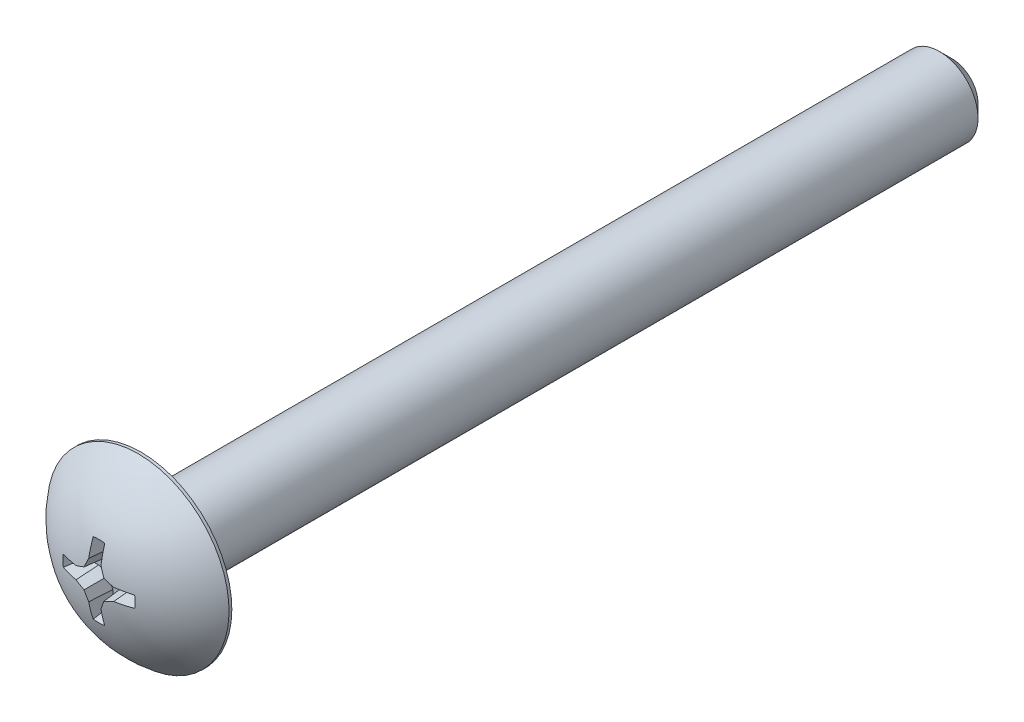
ISO-10303-21;
HEADER;
FILE_DESCRIPTION(('STEP AP214'),'2;1');
FILE_NAME('part.step','',(''),(''),'','','');
FILE_SCHEMA(('AUTOMOTIVE_DESIGN { 1 0 10303 214 1 1 1 1 }'));
ENDSEC;
DATA;
#1=APPLICATION_CONTEXT('core data for automotive mechanical design processes');
#2=APPLICATION_PROTOCOL_DEFINITION('international standard','automotive_design',2000,#1);
#3=PRODUCT_CONTEXT('',#1,'mechanical');
#4=PRODUCT('Part','Part','',(#3));
#5=PRODUCT_RELATED_PRODUCT_CATEGORY('part','',(#4));
#6=PRODUCT_DEFINITION_FORMATION('','',#4);
#7=PRODUCT_DEFINITION_CONTEXT('part definition',#1,'design');
#8=PRODUCT_DEFINITION('design','',#6,#7);
#9=PRODUCT_DEFINITION_SHAPE('','',#8);
#10=(LENGTH_UNIT() NAMED_UNIT(*) SI_UNIT(.MILLI.,.METRE.));
#11=(NAMED_UNIT(*) PLANE_ANGLE_UNIT() SI_UNIT($,.RADIAN.));
#12=(NAMED_UNIT(*) SI_UNIT($,.STERADIAN.) SOLID_ANGLE_UNIT());
#13=UNCERTAINTY_MEASURE_WITH_UNIT(LENGTH_MEASURE(1.E-05),#10,'distance_accuracy_value','');
#14=(GEOMETRIC_REPRESENTATION_CONTEXT(3) GLOBAL_UNCERTAINTY_ASSIGNED_CONTEXT((#13)) GLOBAL_UNIT_ASSIGNED_CONTEXT((#10,
#11,#12)) REPRESENTATION_CONTEXT('',''));
#15=CARTESIAN_POINT('',(0.,0.,0.));
#16=DIRECTION('',(0.,0.,1.));
#17=DIRECTION('',(1.,0.,0.));
#18=AXIS2_PLACEMENT_3D('',#15,#16,#17);
#19=CARTESIAN_POINT('',(0.,2.41299999999999,0.));
#20=DIRECTION('',(0.,0.,-1.));
#21=DIRECTION('',(0.,1.,0.));
#22=AXIS2_PLACEMENT_3D('',#19,#20,#21);
#23=PLANE('',#22);
#24=CARTESIAN_POINT('',(0.,0.,0.));
#25=DIRECTION('',(0.,0.,1.));
#26=DIRECTION('',(0.,-1.,0.));
#27=AXIS2_PLACEMENT_3D('',#24,#25,#26);
#28=CIRCLE('',#27,2.41299999999999);
#29=CARTESIAN_POINT('',(0.,-2.41299999999999,0.));
#30=VERTEX_POINT('',#29);
#31=EDGE_CURVE('E62',#30,#30,#28,.T.);
#32=ORIENTED_EDGE('',*,*,#31,.T.);
#33=EDGE_LOOP('',(#32));
#34=FACE_BOUND('',#33,.T.);
#35=ADVANCED_FACE('F49',(#34),#23,.F.);
#36=CARTESIAN_POINT('',(0.,0.,-50.8));
#37=DIRECTION('',(0.,0.,1.));
#38=DIRECTION('',(0.,-1.,0.));
#39=AXIS2_PLACEMENT_3D('',#36,#37,#38);
#40=PLANE('',#39);
#41=CARTESIAN_POINT('',(0.,0.,-50.8));
#42=DIRECTION('',(0.,0.,1.));
#43=DIRECTION('',(0.,-1.,0.));
#44=AXIS2_PLACEMENT_3D('',#41,#42,#43);
#45=CIRCLE('',#44,1.61925);
#46=CARTESIAN_POINT('',(0.,-1.61925,-50.8));
#47=VERTEX_POINT('',#46);
#48=EDGE_CURVE('E11',#47,#47,#45,.F.);
#49=ORIENTED_EDGE('',*,*,#48,.T.);
#50=EDGE_LOOP('',(#49));
#51=FACE_BOUND('',#50,.T.);
#52=ADVANCED_FACE('F73',(#51),#40,.F.);
#53=CARTESIAN_POINT('',(0.,0.,0.));
#54=DIRECTION('',(0.,0.,1.));
#55=DIRECTION('',(0.,-1.,0.));
#56=AXIS2_PLACEMENT_3D('',#53,#54,#55);
#57=CYLINDRICAL_SURFACE('',#56,2.41299999999999);
#58=CARTESIAN_POINT('',(0.,0.,-50.00625));
#59=DIRECTION('',(0.,0.,1.));
#60=DIRECTION('',(0.,-1.,0.));
#61=AXIS2_PLACEMENT_3D('',#58,#59,#60);
#62=CIRCLE('',#61,2.41299999999999);
#63=CARTESIAN_POINT('',(0.,-2.41299999999999,-50.00625));
#64=VERTEX_POINT('',#63);
#65=EDGE_CURVE('E57',#64,#64,#62,.T.);
#66=ORIENTED_EDGE('',*,*,#65,.T.);
#67=EDGE_LOOP('',(#66));
#68=FACE_BOUND('',#67,.T.);
#69=ORIENTED_EDGE('',*,*,#31,.F.);
#70=EDGE_LOOP('',(#69));
#71=FACE_BOUND('',#70,.T.);
#72=ADVANCED_FACE('F71',(#68,#71),#57,.T.);
#73=CARTESIAN_POINT('',(0.,0.,-50.00625));
#74=DIRECTION('',(0.,0.,1.));
#75=DIRECTION('',(0.,-1.,0.));
#76=AXIS2_PLACEMENT_3D('',#73,#74,#75);
#77=CONICAL_SURFACE('',#76,2.41299999999999,0.785398163397447);
#78=ORIENTED_EDGE('',*,*,#48,.F.);
#79=EDGE_LOOP('',(#78));
#80=FACE_BOUND('',#79,.T.);
#81=ORIENTED_EDGE('',*,*,#65,.F.);
#82=EDGE_LOOP('',(#81));
#83=FACE_BOUND('',#82,.T.);
#84=ADVANCED_FACE('F51',(#80,#83),#77,.T.);
#85=CLOSED_SHELL('',(#35,#52,#72,#84));
#86=MANIFOLD_SOLID_BREP('B2',#85);
#87=CARTESIAN_POINT('',(0.,0.,2.9972));
#88=DIRECTION('',(0.,0.,-1.));
#89=DIRECTION('',(-1.,0.,0.));
#90=AXIS2_PLACEMENT_3D('',#87,#88,#89);
#91=CYLINDRICAL_SURFACE('',#90,5.6896);
#92=CARTESIAN_POINT('',(0.,0.,0.175259999999999));
#93=DIRECTION('',(0.,0.,-1.));
#94=DIRECTION('',(0.,1.,0.));
#95=AXIS2_PLACEMENT_3D('',#92,#93,#94);
#96=CIRCLE('',#95,5.6896);
#97=CARTESIAN_POINT('',(0.,5.6896,0.17526));
#98=VERTEX_POINT('',#97);
#99=EDGE_CURVE('E361',#98,#98,#96,.T.);
#100=ORIENTED_EDGE('',*,*,#99,.T.);
#101=EDGE_LOOP('',(#100));
#102=FACE_BOUND('',#101,.T.);
#103=CARTESIAN_POINT('',(0.,0.,0.));
#104=DIRECTION('',(0.,0.,1.));
#105=DIRECTION('',(1.,0.,0.));
#106=AXIS2_PLACEMENT_3D('',#103,#104,#105);
#107=CIRCLE('',#106,5.6896);
#108=CARTESIAN_POINT('',(5.6896,0.,0.));
#109=VERTEX_POINT('',#108);
#110=EDGE_CURVE('E396',#109,#109,#107,.T.);
#111=ORIENTED_EDGE('',*,*,#110,.T.);
#112=EDGE_LOOP('',(#111));
#113=FACE_BOUND('',#112,.T.);
#114=ADVANCED_FACE('F108',(#102,#113),#91,.T.);
#115=CARTESIAN_POINT('',(0.,0.,0.));
#116=DIRECTION('',(0.,0.,1.));
#117=DIRECTION('',(1.,0.,0.));
#118=AXIS2_PLACEMENT_3D('',#115,#116,#117);
#119=PLANE('',#118);
#120=ORIENTED_EDGE('',*,*,#110,.F.);
#121=EDGE_LOOP('',(#120));
#122=FACE_BOUND('',#121,.T.);
#123=ADVANCED_FACE('F335',(#122),#119,.F.);
#124=CARTESIAN_POINT('',(0.,0.,-4.14946036903689));
#125=DIRECTION('',(0.,0.,-1.));
#126=DIRECTION('',(0.,1.,0.));
#127=AXIS2_PLACEMENT_3D('',#124,#125,#126);
#128=SPHERICAL_SURFACE('',#127,7.1466603690369);
#129=CARTESIAN_POINT('',(0.,0.,2.62924448609153));
#130=DIRECTION('',(0.,0.,-1.));
#131=DIRECTION('',(-1.,0.,0.));
#132=AXIS2_PLACEMENT_3D('',#129,#130,#131);
#133=CIRCLE('',#132,2.26360661719765);
#134=CARTESIAN_POINT('',(2.23455293899956,0.36150806385115,2.62924448609153));
#135=VERTEX_POINT('',#134);
#136=CARTESIAN_POINT('',(2.23455293899956,-0.361508063851161,2.62924448609153));
#137=VERTEX_POINT('',#136);
#138=EDGE_CURVE('E394',#135,#137,#133,.T.);
#139=ORIENTED_EDGE('',*,*,#138,.T.);
#140=CARTESIAN_POINT('',(0.,0.229792868563413,-4.12935609807849));
#141=DIRECTION('',(0.,0.996194698091746,0.0871557427476585));
#142=DIRECTION('',(0.,-0.0871557427476585,0.996194698091746));
#143=AXIS2_PLACEMENT_3D('',#140,#141,#142);
#144=CIRCLE('',#143,7.14293675501955);
#145=CARTESIAN_POINT('',(1.17921292104676,-0.384213013453613,2.88876324757916));
#146=VERTEX_POINT('',#145);
#147=EDGE_CURVE('E47',#137,#146,#144,.F.);
#148=ORIENTED_EDGE('',*,*,#147,.T.);
#149=CARTESIAN_POINT('',(0.0723348983977782,-0.174631892744802,-4.16599749359437));
#150=DIRECTION('',(-0.381227206369642,0.920363891963229,0.0871557427476585));
#151=DIRECTION('',(-0.923879532511292,-0.382683432365078,0.));
#152=AXIS2_PLACEMENT_3D('',#149,#150,#151);
#153=CIRCLE('',#152,7.14414111831395);
#154=CARTESIAN_POINT('',(0.620700606243538,-0.620700606243543,2.94308613734432));
#155=VERTEX_POINT('',#154);
#156=EDGE_CURVE('E124',#146,#155,#153,.F.);
#157=ORIENTED_EDGE('',*,*,#156,.T.);
#158=CARTESIAN_POINT('',(0.174631892744801,-0.0723348983977793,-4.16599749359437));
#159=DIRECTION('',(-0.920363891963226,0.381227206369651,0.0871557427476585));
#160=DIRECTION('',(-0.382683432365087,-0.923879532511288,0.));
#161=AXIS2_PLACEMENT_3D('',#158,#159,#160);
#162=CIRCLE('',#161,7.14414111831395);
#163=CARTESIAN_POINT('',(0.384213013453602,-1.17921292104676,2.88876324757916));
#164=VERTEX_POINT('',#163);
#165=EDGE_CURVE('E428',#155,#164,#162,.F.);
#166=ORIENTED_EDGE('',*,*,#165,.T.);
#167=CARTESIAN_POINT('',(-0.229792868563416,0.,-4.12935609807849));
#168=DIRECTION('',(-0.996194698091746,0.,0.0871557427476585));
#169=DIRECTION('',(0.0871557427476585,0.,0.996194698091746));
#170=AXIS2_PLACEMENT_3D('',#167,#168,#169);
#171=CIRCLE('',#170,7.14293675501955);
#172=CARTESIAN_POINT('',(0.361508063851143,-2.23455293899956,2.62924448609153));
#173=VERTEX_POINT('',#172);
#174=EDGE_CURVE('E431',#164,#173,#171,.F.);
#175=ORIENTED_EDGE('',*,*,#174,.T.);
#176=CARTESIAN_POINT('',(0.,0.,2.62924448609153));
#177=DIRECTION('',(0.,0.,-1.));
#178=DIRECTION('',(0.,1.,0.));
#179=AXIS2_PLACEMENT_3D('',#176,#177,#178);
#180=CIRCLE('',#179,2.26360661719764);
#181=CARTESIAN_POINT('',(-0.361508063851168,-2.23455293899955,2.62924448609153));
#182=VERTEX_POINT('',#181);
#183=EDGE_CURVE('E434',#173,#182,#180,.T.);
#184=ORIENTED_EDGE('',*,*,#183,.T.);
#185=CARTESIAN_POINT('',(0.229792868563412,0.,-4.12935609807849));
#186=DIRECTION('',(0.996194698091746,0.,0.0871557427476584));
#187=DIRECTION('',(0.0871557427476584,0.,-0.996194698091746));
#188=AXIS2_PLACEMENT_3D('',#185,#186,#187);
#189=CIRCLE('',#188,7.14293675501955);
#190=CARTESIAN_POINT('',(-0.384213013453617,-1.17921292104676,2.88876324757916));
#191=VERTEX_POINT('',#190);
#192=EDGE_CURVE('E513',#182,#191,#189,.F.);
#193=ORIENTED_EDGE('',*,*,#192,.T.);
#194=CARTESIAN_POINT('',(-0.174631892744802,-0.072334898397777,-4.16599749359437));
#195=DIRECTION('',(0.920363891963231,0.381227206369639,0.0871557427476585));
#196=DIRECTION('',(-0.382683432365075,0.923879532511293,0.));
#197=AXIS2_PLACEMENT_3D('',#194,#195,#196);
#198=CIRCLE('',#197,7.14414111831395);
#199=CARTESIAN_POINT('',(-0.620700606243545,-0.620700606243536,2.94308613734432));
#200=VERTEX_POINT('',#199);
#201=EDGE_CURVE('E511',#191,#200,#198,.F.);
#202=ORIENTED_EDGE('',*,*,#201,.T.);
#203=CARTESIAN_POINT('',(-0.0723348983977803,-0.1746318927448,-4.16599749359437));
#204=DIRECTION('',(0.381227206369654,0.920363891963224,0.0871557427476586));
#205=DIRECTION('',(-0.923879532511287,0.38268343236509,0.));
#206=AXIS2_PLACEMENT_3D('',#203,#204,#205);
#207=CIRCLE('',#206,7.14414111831395);
#208=CARTESIAN_POINT('',(-1.17921292104676,-0.384213013453598,2.88876324757916));
#209=VERTEX_POINT('',#208);
#210=EDGE_CURVE('E510',#200,#209,#207,.F.);
#211=ORIENTED_EDGE('',*,*,#210,.T.);
#212=CARTESIAN_POINT('',(0.,0.229792868563416,-4.12935609807849));
#213=DIRECTION('',(0.,0.996194698091746,0.0871557427476586));
#214=DIRECTION('',(0.,-0.0871557427476586,0.996194698091746));
#215=AXIS2_PLACEMENT_3D('',#212,#213,#214);
#216=CIRCLE('',#215,7.14293675501955);
#217=CARTESIAN_POINT('',(-2.23455293899956,-0.361508063851135,2.62924448609153));
#218=VERTEX_POINT('',#217);
#219=EDGE_CURVE('E313',#209,#218,#216,.F.);
#220=ORIENTED_EDGE('',*,*,#219,.T.);
#221=CARTESIAN_POINT('',(0.,0.,2.62924448609153));
#222=DIRECTION('',(0.,0.,-1.));
#223=DIRECTION('',(-1.,0.,0.));
#224=AXIS2_PLACEMENT_3D('',#221,#222,#223);
#225=CIRCLE('',#224,2.26360661719764);
#226=CARTESIAN_POINT('',(-2.23455293899955,0.361508063851176,2.62924448609153));
#227=VERTEX_POINT('',#226);
#228=EDGE_CURVE('E271',#218,#227,#225,.T.);
#229=ORIENTED_EDGE('',*,*,#228,.T.);
#230=CARTESIAN_POINT('',(0.,-0.229792868563412,-4.12935609807849));
#231=DIRECTION('',(0.,-0.996194698091746,0.0871557427476582));
#232=DIRECTION('',(0.,-0.0871557427476582,-0.996194698091746));
#233=AXIS2_PLACEMENT_3D('',#230,#231,#232);
#234=CIRCLE('',#233,7.14293675501955);
#235=CARTESIAN_POINT('',(-1.17921292104675,0.38421301345362,2.88876324757916));
#236=VERTEX_POINT('',#235);
#237=EDGE_CURVE('E268',#227,#236,#234,.F.);
#238=ORIENTED_EDGE('',*,*,#237,.T.);
#239=CARTESIAN_POINT('',(-0.0723348983977769,0.174631892744803,-4.16599749359437));
#240=DIRECTION('',(0.381227206369636,-0.920363891963232,0.0871557427476583));
#241=DIRECTION('',(0.923879532511294,0.382683432365072,0.));
#242=AXIS2_PLACEMENT_3D('',#239,#240,#241);
#243=CIRCLE('',#242,7.14414111831395);
#244=CARTESIAN_POINT('',(-0.620700606243533,0.620700606243547,2.94308613734433));
#245=VERTEX_POINT('',#244);
#246=EDGE_CURVE('E264',#236,#245,#243,.F.);
#247=ORIENTED_EDGE('',*,*,#246,.T.);
#248=CARTESIAN_POINT('',(-0.1746318927448,0.0723348983977814,-4.16599749359437));
#249=DIRECTION('',(0.920363891963223,-0.381227206369657,0.0871557427476584));
#250=DIRECTION('',(0.382683432365094,0.923879532511285,0.));
#251=AXIS2_PLACEMENT_3D('',#248,#249,#250);
#252=CIRCLE('',#251,7.14414111831395);
#253=CARTESIAN_POINT('',(-0.384213013453594,1.17921292104676,2.88876324757916));
#254=VERTEX_POINT('',#253);
#255=EDGE_CURVE('E263',#245,#254,#252,.F.);
#256=ORIENTED_EDGE('',*,*,#255,.T.);
#257=CARTESIAN_POINT('',(0.229792868563416,0.,-4.12935609807849));
#258=DIRECTION('',(0.996194698091746,0.,0.0871557427476585));
#259=DIRECTION('',(0.0871557427476585,0.,-0.996194698091746));
#260=AXIS2_PLACEMENT_3D('',#257,#258,#259);
#261=CIRCLE('',#260,7.14293675501955);
#262=CARTESIAN_POINT('',(-0.361508063851127,2.23455293899956,2.62924448609153));
#263=VERTEX_POINT('',#262);
#264=EDGE_CURVE('E250',#254,#263,#261,.F.);
#265=ORIENTED_EDGE('',*,*,#264,.T.);
#266=CARTESIAN_POINT('',(0.,0.,2.62924448609153));
#267=DIRECTION('',(0.,0.,-1.));
#268=DIRECTION('',(-1.,0.,0.));
#269=AXIS2_PLACEMENT_3D('',#266,#267,#268);
#270=CIRCLE('',#269,2.26360661719765);
#271=CARTESIAN_POINT('',(0.361508063851153,2.23455293899956,2.62924448609153));
#272=VERTEX_POINT('',#271);
#273=EDGE_CURVE('E242',#263,#272,#270,.T.);
#274=ORIENTED_EDGE('',*,*,#273,.T.);
#275=CARTESIAN_POINT('',(-0.229792868563412,0.,-4.12935609807849));
#276=DIRECTION('',(-0.996194698091746,0.,0.0871557427476584));
#277=DIRECTION('',(0.0871557427476584,0.,0.996194698091746));
#278=AXIS2_PLACEMENT_3D('',#275,#276,#277);
#279=CIRCLE('',#278,7.14293675501955);
#280=CARTESIAN_POINT('',(0.384213013453608,1.17921292104676,2.88876324757915));
#281=VERTEX_POINT('',#280);
#282=EDGE_CURVE('E133',#272,#281,#279,.F.);
#283=ORIENTED_EDGE('',*,*,#282,.T.);
#284=CARTESIAN_POINT('',(0.174631892744802,0.0723348983977793,-4.16599749359437));
#285=DIRECTION('',(-0.920363891963228,-0.381227206369645,0.0871557427476584));
#286=DIRECTION('',(0.382683432365081,-0.92387953251129,0.));
#287=AXIS2_PLACEMENT_3D('',#284,#285,#286);
#288=CIRCLE('',#287,7.14414111831395);
#289=CARTESIAN_POINT('',(0.620700606243541,0.62070060624354,2.94308613734433));
#290=VERTEX_POINT('',#289);
#291=EDGE_CURVE('E684',#281,#290,#288,.F.);
#292=ORIENTED_EDGE('',*,*,#291,.T.);
#293=CARTESIAN_POINT('',(0.0723348983977791,0.174631892744802,-4.16599749359437));
#294=DIRECTION('',(-0.381227206369648,-0.920363891963227,0.0871557427476584));
#295=DIRECTION('',(0.923879532511289,-0.382683432365084,0.));
#296=AXIS2_PLACEMENT_3D('',#293,#294,#295);
#297=CIRCLE('',#296,7.14414111831395);
#298=CARTESIAN_POINT('',(1.17921292104676,0.384213013453606,2.88876324757916));
#299=VERTEX_POINT('',#298);
#300=EDGE_CURVE('E695',#290,#299,#297,.F.);
#301=ORIENTED_EDGE('',*,*,#300,.T.);
#302=CARTESIAN_POINT('',(0.,-0.229792868563415,-4.12935609807849));
#303=DIRECTION('',(0.,-0.996194698091746,0.0871557427476584));
#304=DIRECTION('',(0.,-0.0871557427476584,-0.996194698091746));
#305=AXIS2_PLACEMENT_3D('',#302,#303,#304);
#306=CIRCLE('',#305,7.14293675501955);
#307=EDGE_CURVE('E387',#299,#135,#306,.F.);
#308=ORIENTED_EDGE('',*,*,#307,.T.);
#309=EDGE_LOOP('',(#139,#148,#157,#166,#175,#184,#193,#202,#211,#220,#229,#238,#247,#256,#265,
#274,#283,#292,#301,#308));
#310=FACE_BOUND('',#309,.T.);
#311=ORIENTED_EDGE('',*,*,#99,.F.);
#312=EDGE_LOOP('',(#311));
#313=FACE_BOUND('',#312,.T.);
#314=ADVANCED_FACE('F260',(#310,#313),#128,.T.);
#315=CARTESIAN_POINT('',(0.,0.,2.99720000000001));
#316=DIRECTION('',(0.,0.,1.));
#317=DIRECTION('',(1.,0.,0.));
#318=AXIS2_PLACEMENT_3D('',#315,#316,#317);
#319=CONICAL_SURFACE('',#318,2.3622,0.26179938779915);
#320=ORIENTED_EDGE('',*,*,#273,.F.);
#321=CARTESIAN_POINT('',(-0.262589488840027,1.94298750337409,1.4986));
#322=CARTESIAN_POINT('',(-0.279073393107845,1.99169451778232,1.68701188793488));
#323=CARTESIAN_POINT('',(-0.295558559878558,2.04034514477638,1.87543820634387));
#324=CARTESIAN_POINT('',(-0.328531418215623,2.13753362331677,2.25231970170808));
#325=CARTESIAN_POINT('',(-0.345019109781944,2.18607147486453,2.44077487866293));
#326=CARTESIAN_POINT('',(-0.361508063851127,2.23455293899956,2.62924448609153));
#327=B_SPLINE_CURVE_WITH_KNOTS('',3,(#321,#322,#323,#324,#325,#326),.UNSPECIFIED.,.F.,.F.,(4,2,
4),(0.,0.585907923906023,1.17181584034365),.UNSPECIFIED.);
#328=CARTESIAN_POINT('',(-0.262589488840027,1.94298750337409,1.4986));
#329=VERTEX_POINT('',#328);
#330=EDGE_CURVE('E112',#329,#263,#327,.T.);
#331=ORIENTED_EDGE('',*,*,#330,.F.);
#332=CARTESIAN_POINT('',(0.,0.,1.4986));
#333=DIRECTION('',(0.,0.,1.));
#334=DIRECTION('',(1.,0.,0.));
#335=AXIS2_PLACEMENT_3D('',#332,#333,#334);
#336=CIRCLE('',#335,1.96065134022272);
#337=CARTESIAN_POINT('',(0.26258948884005,1.94298750337409,1.4986));
#338=VERTEX_POINT('',#337);
#339=EDGE_CURVE('E386',#338,#329,#336,.T.);
#340=ORIENTED_EDGE('',*,*,#339,.F.);
#341=CARTESIAN_POINT('',(0.26258948884005,1.94298750337409,1.4986));
#342=CARTESIAN_POINT('',(0.284499109870333,2.00773502668209,1.74902811430982));
#343=CARTESIAN_POINT('',(0.30641133893513,2.07236620771867,1.99948603859054));
#344=CARTESIAN_POINT('',(0.350239968451299,2.20144176390614,2.5004495663187));
#345=CARTESIAN_POINT('',(0.37215636890122,2.26588613912187,2.75095516974956));
#346=CARTESIAN_POINT('',(0.415992308238139,2.39463399699335,3.25200224911122));
#347=CARTESIAN_POINT('',(0.437911847124638,2.45893747967146,3.50254372503631));
#348=CARTESIAN_POINT('',(0.481753455551134,2.58743114455713,4.00365560238833));
#349=CARTESIAN_POINT('',(0.503675525091998,2.65162132672573,4.25422600382518));
#350=CARTESIAN_POINT('',(0.525598546790906,2.71576862745352,4.50480728847827));
#351=B_SPLINE_CURVE_WITH_KNOTS('',3,(#341,#342,#343,#344,#345,#346,#347,#348,#349,#350),
.UNSPECIFIED.,.F.,.F.,(4,2,2,2,4),(0.,0.778767288895853,1.55753430752661,2.33630120266548,
3.1150683656789),.UNSPECIFIED.);
#352=EDGE_CURVE('E247',#338,#272,#351,.T.);
#353=ORIENTED_EDGE('',*,*,#352,.T.);
#354=EDGE_LOOP('',(#320,#331,#340,#353));
#355=FACE_BOUND('',#354,.T.);
#356=ADVANCED_FACE('F244',(#355),#319,.F.);
#357=CARTESIAN_POINT('',(0.3937,0.,2.99720000000001));
#358=DIRECTION('',(-0.996194698091746,0.,0.0871557427476584));
#359=DIRECTION('',(0.0871557427476584,0.,0.996194698091746));
#360=AXIS2_PLACEMENT_3D('',#357,#358,#359);
#361=PLANE('',#360);
#362=ORIENTED_EDGE('',*,*,#352,.F.);
#363=DIRECTION('',(0.,-1.,0.));
#364=VECTOR('',#363,1.);
#365=CARTESIAN_POINT('',(0.26258948884005,0.,1.4986));
#366=LINE('',#365,#364);
#367=CARTESIAN_POINT('',(0.26258948884005,1.15502049783682,1.4986));
#368=VERTEX_POINT('',#367);
#369=EDGE_CURVE('E363',#368,#338,#366,.F.);
#370=ORIENTED_EDGE('',*,*,#369,.F.);
#371=DIRECTION('',(0.0871426484044397,0.0173337504938598,0.996045029063886));
#372=VECTOR('',#371,1.);
#373=CARTESIAN_POINT('',(0.391915937908899,1.18074512798591,2.97680807698735));
#374=LINE('',#373,#372);
#375=EDGE_CURVE('E362',#368,#281,#374,.T.);
#376=ORIENTED_EDGE('',*,*,#375,.T.);
#377=ORIENTED_EDGE('',*,*,#282,.F.);
#378=EDGE_LOOP('',(#362,#370,#376,#377));
#379=FACE_BOUND('',#378,.T.);
#380=ADVANCED_FACE('F349',(#379),#361,.T.);
#381=CARTESIAN_POINT('',(0.753625879506282,0.312162060246846,2.99720000000001));
#382=DIRECTION('',(-0.920363891963228,-0.381227206369645,0.0871557427476584));
#383=DIRECTION('',(0.382683432365081,-0.92387953251129,0.));
#384=AXIS2_PLACEMENT_3D('',#381,#382,#383);
#385=PLANE('',#384);
#386=ORIENTED_EDGE('',*,*,#375,.F.);
#387=DIRECTION('',(0.382683432365081,-0.92387953251129,0.));
#388=VECTOR('',#387,1.);
#389=CARTESIAN_POINT('',(0.632495561748511,0.261988239817016,1.4986));
#390=LINE('',#389,#388);
#391=CARTESIAN_POINT('',(0.523976479634046,0.523976479634045,1.4986));
#392=VERTEX_POINT('',#391);
#393=EDGE_CURVE('E478',#392,#368,#390,.F.);
#394=ORIENTED_EDGE('',*,*,#393,.F.);
#395=DIRECTION('',(0.0666626913468327,0.0666626913468325,0.995546167269401));
#396=VECTOR('',#395,1.);
#397=CARTESIAN_POINT('',(0.623511504964646,0.623511504964645,2.98506433222127));
#398=LINE('',#397,#396);
#399=EDGE_CURVE('E685',#392,#290,#398,.T.);
#400=ORIENTED_EDGE('',*,*,#399,.T.);
#401=ORIENTED_EDGE('',*,*,#291,.F.);
#402=EDGE_LOOP('',(#386,#394,#400,#401));
#403=FACE_BOUND('',#402,.T.);
#404=ADVANCED_FACE('F369',(#403),#385,.T.);
#405=CARTESIAN_POINT('',(0.312162060246848,0.753625879506282,2.99720000000001));
#406=DIRECTION('',(-0.381227206369648,-0.920363891963227,0.0871557427476584));
#407=DIRECTION('',(0.923879532511289,-0.382683432365084,0.));
#408=AXIS2_PLACEMENT_3D('',#405,#406,#407);
#409=PLANE('',#408);
#410=ORIENTED_EDGE('',*,*,#399,.F.);
#411=DIRECTION('',(0.923879532511289,-0.382683432365084,0.));
#412=VECTOR('',#411,1.);
#413=CARTESIAN_POINT('',(0.261988239817018,0.632495561748511,1.4986));
#414=LINE('',#413,#412);
#415=CARTESIAN_POINT('',(1.15502049783682,0.262589488840047,1.4986));
#416=VERTEX_POINT('',#415);
#417=EDGE_CURVE('E474',#416,#392,#414,.F.);
#418=ORIENTED_EDGE('',*,*,#417,.F.);
#419=DIRECTION('',(0.01733375049386,0.0871426484044397,0.996045029063886));
#420=VECTOR('',#419,1.);
#421=CARTESIAN_POINT('',(1.18138259111035,0.39512068144917,3.01343846326961));
#422=LINE('',#421,#420);
#423=EDGE_CURVE('E385',#416,#299,#422,.T.);
#424=ORIENTED_EDGE('',*,*,#423,.T.);
#425=ORIENTED_EDGE('',*,*,#300,.F.);
#426=EDGE_LOOP('',(#410,#418,#424,#425));
#427=FACE_BOUND('',#426,.T.);
#428=ADVANCED_FACE('F374',(#427),#409,.T.);
#429=CARTESIAN_POINT('',(0.,0.393699999999997,2.99720000000001));
#430=DIRECTION('',(0.,-0.996194698091746,0.0871557427476584));
#431=DIRECTION('',(0.,-0.0871557427476584,-0.996194698091746));
#432=AXIS2_PLACEMENT_3D('',#429,#430,#431);
#433=PLANE('',#432);
#434=ORIENTED_EDGE('',*,*,#423,.F.);
#435=DIRECTION('',(1.,0.,0.));
#436=VECTOR('',#435,1.);
#437=CARTESIAN_POINT('',(0.,0.262589488840047,1.4986));
#438=LINE('',#437,#436);
#439=CARTESIAN_POINT('',(1.94298750337409,0.262589488840047,1.4986));
#440=VERTEX_POINT('',#439);
#441=EDGE_CURVE('E392',#440,#416,#438,.F.);
#442=ORIENTED_EDGE('',*,*,#441,.F.);
#443=CARTESIAN_POINT('',(1.94298750337409,0.262589488840047,1.4986));
#444=CARTESIAN_POINT('',(1.99169451778231,0.279073393107866,1.68701188793488));
#445=CARTESIAN_POINT('',(2.04034514477638,0.295558559878579,1.87543820634387));
#446=CARTESIAN_POINT('',(2.13753362331677,0.328531418215645,2.25231970170808));
#447=CARTESIAN_POINT('',(2.18607147486452,0.345019109781967,2.44077487866293));
#448=CARTESIAN_POINT('',(2.23455293899956,0.36150806385115,2.62924448609153));
#449=B_SPLINE_CURVE_WITH_KNOTS('',3,(#443,#444,#445,#446,#447,#448),.UNSPECIFIED.,.F.,.F.,(4,2,
4),(0.,0.585907923906023,1.17181584034365),.UNSPECIFIED.);
#450=EDGE_CURVE('E377',#440,#135,#449,.T.);
#451=ORIENTED_EDGE('',*,*,#450,.T.);
#452=ORIENTED_EDGE('',*,*,#307,.F.);
#453=EDGE_LOOP('',(#434,#442,#451,#452));
#454=FACE_BOUND('',#453,.T.);
#455=ADVANCED_FACE('F370',(#454),#433,.T.);
#456=CARTESIAN_POINT('',(0.,0.,2.99720000000001));
#457=DIRECTION('',(0.,0.,1.));
#458=DIRECTION('',(1.,0.,0.));
#459=AXIS2_PLACEMENT_3D('',#456,#457,#458);
#460=CONICAL_SURFACE('',#459,2.3622,0.26179938779915);
#461=ORIENTED_EDGE('',*,*,#450,.F.);
#462=CARTESIAN_POINT('',(0.,0.,1.4986));
#463=DIRECTION('',(0.,0.,1.));
#464=DIRECTION('',(1.,0.,0.));
#465=AXIS2_PLACEMENT_3D('',#462,#463,#464);
#466=CIRCLE('',#465,1.96065134022272);
#467=CARTESIAN_POINT('',(1.94298750337408,-0.262589488840057,1.4986));
#468=VERTEX_POINT('',#467);
#469=EDGE_CURVE('E389',#468,#440,#466,.T.);
#470=ORIENTED_EDGE('',*,*,#469,.F.);
#471=CARTESIAN_POINT('',(1.94298750337408,-0.262589488840057,1.4986));
#472=CARTESIAN_POINT('',(2.00773502668209,-0.28449910987034,1.74902811430982));
#473=CARTESIAN_POINT('',(2.07236620771867,-0.306411338935138,1.99948603859054));
#474=CARTESIAN_POINT('',(2.20144176390614,-0.350239968451307,2.5004495663187));
#475=CARTESIAN_POINT('',(2.26588613912186,-0.372156368901229,2.75095516974956));
#476=CARTESIAN_POINT('',(2.39463399699335,-0.415992308238148,3.25200224911121));
#477=CARTESIAN_POINT('',(2.45893747967145,-0.437911847124647,3.50254372503631));
#478=CARTESIAN_POINT('',(2.58743114455713,-0.481753455551143,4.00365560238833));
#479=CARTESIAN_POINT('',(2.65162132672572,-0.503675525092008,4.25422600382518));
#480=CARTESIAN_POINT('',(2.71576862745351,-0.525598546790916,4.50480728847827));
#481=B_SPLINE_CURVE_WITH_KNOTS('',3,(#471,#472,#473,#474,#475,#476,#477,#478,#479,#480),
.UNSPECIFIED.,.F.,.F.,(4,2,2,2,4),(0.,0.778767288895853,1.55753430752661,2.33630120266548,
3.1150683656789),.UNSPECIFIED.);
#482=EDGE_CURVE('E393',#468,#137,#481,.T.);
#483=ORIENTED_EDGE('',*,*,#482,.T.);
#484=ORIENTED_EDGE('',*,*,#138,.F.);
#485=EDGE_LOOP('',(#461,#470,#483,#484));
#486=FACE_BOUND('',#485,.T.);
#487=ADVANCED_FACE('F350',(#486),#460,.F.);
#488=CARTESIAN_POINT('',(0.,0.,1.4986));
#489=DIRECTION('',(0.,0.,1.));
#490=DIRECTION('',(1.,0.,0.));
#491=AXIS2_PLACEMENT_3D('',#488,#489,#490);
#492=PLANE('',#491);
#493=DIRECTION('',(-1.,0.,0.));
#494=VECTOR('',#493,1.);
#495=CARTESIAN_POINT('',(0.,-0.26258948884005,1.4986));
#496=LINE('',#495,#494);
#497=CARTESIAN_POINT('',(1.15502049783682,-0.262589488840054,1.4986));
#498=VERTEX_POINT('',#497);
#499=EDGE_CURVE('E417',#498,#468,#496,.F.);
#500=ORIENTED_EDGE('',*,*,#499,.T.);
#501=ORIENTED_EDGE('',*,*,#469,.T.);
#502=ORIENTED_EDGE('',*,*,#441,.T.);
#503=ORIENTED_EDGE('',*,*,#417,.T.);
#504=ORIENTED_EDGE('',*,*,#393,.T.);
#505=ORIENTED_EDGE('',*,*,#369,.T.);
#506=ORIENTED_EDGE('',*,*,#339,.T.);
#507=DIRECTION('',(0.,1.,0.));
#508=VECTOR('',#507,1.);
#509=CARTESIAN_POINT('',(-0.262589488840047,0.,1.4986));
#510=LINE('',#509,#508);
#511=CARTESIAN_POINT('',(-0.262589488840035,1.15502049783682,1.4986));
#512=VERTEX_POINT('',#511);
#513=EDGE_CURVE('E256',#329,#512,#510,.F.);
#514=ORIENTED_EDGE('',*,*,#513,.T.);
#515=DIRECTION('',(0.382683432365094,0.923879532511285,0.));
#516=VECTOR('',#515,1.);
#517=CARTESIAN_POINT('',(-0.632495561748508,0.261988239817024,1.4986));
#518=LINE('',#517,#516);
#519=CARTESIAN_POINT('',(-0.523976479634039,0.523976479634051,1.4986));
#520=VERTEX_POINT('',#519);
#521=EDGE_CURVE('E496',#512,#520,#518,.F.);
#522=ORIENTED_EDGE('',*,*,#521,.T.);
#523=DIRECTION('',(0.923879532511294,0.382683432365072,0.));
#524=VECTOR('',#523,1.);
#525=CARTESIAN_POINT('',(-0.261988239817009,0.632495561748514,1.4986));
#526=LINE('',#525,#524);
#527=CARTESIAN_POINT('',(-1.15502049783681,0.262589488840062,1.4986));
#528=VERTEX_POINT('',#527);
#529=EDGE_CURVE('E498',#520,#528,#526,.F.);
#530=ORIENTED_EDGE('',*,*,#529,.T.);
#531=DIRECTION('',(1.,0.,0.));
#532=VECTOR('',#531,1.);
#533=CARTESIAN_POINT('',(0.,0.26258948884005,1.4986));
#534=LINE('',#533,#532);
#535=CARTESIAN_POINT('',(-1.94298750337408,0.26258948884007,1.4986));
#536=VERTEX_POINT('',#535);
#537=EDGE_CURVE('E258',#528,#536,#534,.F.);
#538=ORIENTED_EDGE('',*,*,#537,.T.);
#539=CARTESIAN_POINT('',(0.,0.,1.4986));
#540=DIRECTION('',(0.,0.,1.));
#541=DIRECTION('',(1.,0.,0.));
#542=AXIS2_PLACEMENT_3D('',#539,#540,#541);
#543=CIRCLE('',#542,1.96065134022272);
#544=CARTESIAN_POINT('',(-1.94298750337409,-0.262589488840034,1.4986));
#545=VERTEX_POINT('',#544);
#546=EDGE_CURVE('E281',#536,#545,#543,.T.);
#547=ORIENTED_EDGE('',*,*,#546,.T.);
#548=DIRECTION('',(-1.,0.,0.));
#549=VECTOR('',#548,1.);
#550=CARTESIAN_POINT('',(0.,-0.262589488840047,1.4986));
#551=LINE('',#550,#549);
#552=CARTESIAN_POINT('',(-1.15502049783682,-0.262589488840039,1.4986));
#553=VERTEX_POINT('',#552);
#554=EDGE_CURVE('E534',#545,#553,#551,.F.);
#555=ORIENTED_EDGE('',*,*,#554,.T.);
#556=DIRECTION('',(-0.923879532511287,0.38268343236509,0.));
#557=VECTOR('',#556,1.);
#558=CARTESIAN_POINT('',(-0.261988239817022,-0.632495561748509,1.4986));
#559=LINE('',#558,#557);
#560=CARTESIAN_POINT('',(-0.523976479634049,-0.523976479634041,1.4986));
#561=VERTEX_POINT('',#560);
#562=EDGE_CURVE('E531',#553,#561,#559,.F.);
#563=ORIENTED_EDGE('',*,*,#562,.T.);
#564=DIRECTION('',(-0.382683432365075,0.923879532511293,0.));
#565=VECTOR('',#564,1.);
#566=CARTESIAN_POINT('',(-0.632495561748513,-0.261988239817012,1.4986));
#567=LINE('',#566,#565);
#568=CARTESIAN_POINT('',(-0.262589488840058,-1.15502049783682,1.4986));
#569=VERTEX_POINT('',#568);
#570=EDGE_CURVE('E528',#561,#569,#567,.F.);
#571=ORIENTED_EDGE('',*,*,#570,.T.);
#572=DIRECTION('',(0.,1.,0.));
#573=VECTOR('',#572,1.);
#574=CARTESIAN_POINT('',(-0.26258948884005,0.,1.4986));
#575=LINE('',#574,#573);
#576=CARTESIAN_POINT('',(-0.262589488840063,-1.94298750337408,1.4986));
#577=VERTEX_POINT('',#576);
#578=EDGE_CURVE('E312',#569,#577,#575,.F.);
#579=ORIENTED_EDGE('',*,*,#578,.T.);
#580=CARTESIAN_POINT('',(0.,0.,1.4986));
#581=DIRECTION('',(0.,0.,1.));
#582=DIRECTION('',(1.,0.,0.));
#583=AXIS2_PLACEMENT_3D('',#580,#581,#582);
#584=CIRCLE('',#583,1.96065134022272);
#585=CARTESIAN_POINT('',(0.26258948884004,-1.94298750337409,1.4986));
#586=VERTEX_POINT('',#585);
#587=EDGE_CURVE('E411',#577,#586,#584,.T.);
#588=ORIENTED_EDGE('',*,*,#587,.T.);
#589=DIRECTION('',(0.,-1.,0.));
#590=VECTOR('',#589,1.);
#591=CARTESIAN_POINT('',(0.262589488840047,0.,1.4986));
#592=LINE('',#591,#590);
#593=CARTESIAN_POINT('',(0.262589488840043,-1.15502049783682,1.4986));
#594=VERTEX_POINT('',#593);
#595=EDGE_CURVE('E407',#586,#594,#592,.F.);
#596=ORIENTED_EDGE('',*,*,#595,.T.);
#597=DIRECTION('',(-0.382683432365087,-0.923879532511288,0.));
#598=VECTOR('',#597,1.);
#599=CARTESIAN_POINT('',(0.63249556174851,-0.26198823981702,1.4986));
#600=LINE('',#599,#598);
#601=CARTESIAN_POINT('',(0.523976479634043,-0.523976479634048,1.4986));
#602=VERTEX_POINT('',#601);
#603=EDGE_CURVE('E410',#594,#602,#600,.F.);
#604=ORIENTED_EDGE('',*,*,#603,.T.);
#605=DIRECTION('',(-0.923879532511292,-0.382683432365078,0.));
#606=VECTOR('',#605,1.);
#607=CARTESIAN_POINT('',(0.261988239817014,-0.632495561748512,1.4986));
#608=LINE('',#607,#606);
#609=EDGE_CURVE('E414',#602,#498,#608,.F.);
#610=ORIENTED_EDGE('',*,*,#609,.T.);
#611=EDGE_LOOP('',(#500,#501,#502,#503,#504,#505,#506,#514,#522,#530,#538,#547,#555,#563,#571,
#579,#588,#596,#604,#610));
#612=FACE_BOUND('',#611,.T.);
#613=ADVANCED_FACE('F456',(#612),#492,.T.);
#614=CARTESIAN_POINT('',(0.,-0.3937,2.99720000000001));
#615=DIRECTION('',(0.,0.996194698091746,0.0871557427476585));
#616=DIRECTION('',(0.,-0.0871557427476585,0.996194698091746));
#617=AXIS2_PLACEMENT_3D('',#614,#615,#616);
#618=PLANE('',#617);
#619=ORIENTED_EDGE('',*,*,#482,.F.);
#620=ORIENTED_EDGE('',*,*,#499,.F.);
#621=DIRECTION('',(0.0173337504938596,-0.0871426484044399,0.996045029063886));
#622=VECTOR('',#621,1.);
#623=CARTESIAN_POINT('',(1.18074512798591,-0.391915937908904,2.97680807698735));
#624=LINE('',#623,#622);
#625=EDGE_CURVE('E404',#498,#146,#624,.T.);
#626=ORIENTED_EDGE('',*,*,#625,.T.);
#627=ORIENTED_EDGE('',*,*,#147,.F.);
#628=EDGE_LOOP('',(#619,#620,#626,#627));
#629=FACE_BOUND('',#628,.T.);
#630=ADVANCED_FACE('F297',(#629),#618,.T.);
#631=CARTESIAN_POINT('',(0.312162060246844,-0.753625879506284,2.99720000000001));
#632=DIRECTION('',(-0.381227206369642,0.920363891963229,0.0871557427476585));
#633=DIRECTION('',(-0.923879532511292,-0.382683432365078,0.));
#634=AXIS2_PLACEMENT_3D('',#631,#632,#633);
#635=PLANE('',#634);
#636=ORIENTED_EDGE('',*,*,#625,.F.);
#637=ORIENTED_EDGE('',*,*,#609,.F.);
#638=DIRECTION('',(0.0666626913468324,-0.066662691346833,0.995546167269401));
#639=VECTOR('',#638,1.);
#640=CARTESIAN_POINT('',(0.623511504964643,-0.623511504964649,2.98506433222127));
#641=LINE('',#640,#639);
#642=EDGE_CURVE('E400',#602,#155,#641,.T.);
#643=ORIENTED_EDGE('',*,*,#642,.T.);
#644=ORIENTED_EDGE('',*,*,#156,.F.);
#645=EDGE_LOOP('',(#636,#637,#643,#644));
#646=FACE_BOUND('',#645,.T.);
#647=ADVANCED_FACE('F449',(#646),#635,.T.);
#648=CARTESIAN_POINT('',(0.753625879506281,-0.312162060246851,2.99720000000001));
#649=DIRECTION('',(-0.920363891963226,0.381227206369651,0.0871557427476585));
#650=DIRECTION('',(-0.382683432365087,-0.923879532511288,0.));
#651=AXIS2_PLACEMENT_3D('',#648,#649,#650);
#652=PLANE('',#651);
#653=ORIENTED_EDGE('',*,*,#642,.F.);
#654=ORIENTED_EDGE('',*,*,#603,.F.);
#655=DIRECTION('',(0.0871426484044397,-0.0173337504938603,0.996045029063886));
#656=VECTOR('',#655,1.);
#657=CARTESIAN_POINT('',(0.395120681449166,-1.18138259111035,3.01343846326961));
#658=LINE('',#657,#656);
#659=EDGE_CURVE('E397',#594,#164,#658,.T.);
#660=ORIENTED_EDGE('',*,*,#659,.T.);
#661=ORIENTED_EDGE('',*,*,#165,.F.);
#662=EDGE_LOOP('',(#653,#654,#660,#661));
#663=FACE_BOUND('',#662,.T.);
#664=ADVANCED_FACE('F446',(#663),#652,.T.);
#665=CARTESIAN_POINT('',(0.393699999999998,0.,2.99720000000001));
#666=DIRECTION('',(-0.996194698091746,0.,0.0871557427476585));
#667=DIRECTION('',(0.0871557427476585,0.,0.996194698091746));
#668=AXIS2_PLACEMENT_3D('',#665,#666,#667);
#669=PLANE('',#668);
#670=ORIENTED_EDGE('',*,*,#659,.F.);
#671=ORIENTED_EDGE('',*,*,#595,.F.);
#672=CARTESIAN_POINT('',(0.26258948884004,-1.94298750337409,1.4986));
#673=CARTESIAN_POINT('',(0.279073393107859,-1.99169451778231,1.68701188793488));
#674=CARTESIAN_POINT('',(0.295558559878572,-2.04034514477638,1.87543820634387));
#675=CARTESIAN_POINT('',(0.328531418215638,-2.13753362331677,2.25231970170808));
#676=CARTESIAN_POINT('',(0.345019109781959,-2.18607147486452,2.44077487866293));
#677=CARTESIAN_POINT('',(0.361508063851143,-2.23455293899956,2.62924448609153));
#678=B_SPLINE_CURVE_WITH_KNOTS('',3,(#672,#673,#674,#675,#676,#677),.UNSPECIFIED.,.F.,.F.,(4,2,
4),(0.,0.585907923906022,1.17181584034365),.UNSPECIFIED.);
#679=EDGE_CURVE('E401',#586,#173,#678,.T.);
#680=ORIENTED_EDGE('',*,*,#679,.T.);
#681=ORIENTED_EDGE('',*,*,#174,.F.);
#682=EDGE_LOOP('',(#670,#671,#680,#681));
#683=FACE_BOUND('',#682,.T.);
#684=ADVANCED_FACE('F442',(#683),#669,.T.);
#685=CARTESIAN_POINT('',(0.,0.,2.99720000000001));
#686=DIRECTION('',(0.,0.,1.));
#687=DIRECTION('',(0.,-1.,0.));
#688=AXIS2_PLACEMENT_3D('',#685,#686,#687);
#689=CONICAL_SURFACE('',#688,2.3622,0.26179938779915);
#690=ORIENTED_EDGE('',*,*,#679,.F.);
#691=ORIENTED_EDGE('',*,*,#587,.F.);
#692=CARTESIAN_POINT('',(-0.262589488840063,-1.94298750337408,1.4986));
#693=CARTESIAN_POINT('',(-0.284499109870347,-2.00773502668209,1.74902811430982));
#694=CARTESIAN_POINT('',(-0.306411338935144,-2.07236620771866,1.99948603859054));
#695=CARTESIAN_POINT('',(-0.350239968451314,-2.20144176390614,2.5004495663187));
#696=CARTESIAN_POINT('',(-0.372156368901236,-2.26588613912186,2.75095516974956));
#697=CARTESIAN_POINT('',(-0.415992308238156,-2.39463399699335,3.25200224911121));
#698=CARTESIAN_POINT('',(-0.437911847124655,-2.45893747967145,3.50254372503631));
#699=CARTESIAN_POINT('',(-0.481753455551152,-2.58743114455713,4.00365560238833));
#700=CARTESIAN_POINT('',(-0.503675525092016,-2.65162132672572,4.25422600382518));
#701=CARTESIAN_POINT('',(-0.525598546790924,-2.71576862745351,4.50480728847827));
#702=B_SPLINE_CURVE_WITH_KNOTS('',3,(#692,#693,#694,#695,#696,#697,#698,#699,#700,#701),
.UNSPECIFIED.,.F.,.F.,(4,2,2,2,4),(0.,0.778767288895853,1.55753430752661,2.33630120266548,
3.1150683656789),.UNSPECIFIED.);
#703=EDGE_CURVE('E518',#577,#182,#702,.T.);
#704=ORIENTED_EDGE('',*,*,#703,.T.);
#705=ORIENTED_EDGE('',*,*,#183,.F.);
#706=EDGE_LOOP('',(#690,#691,#704,#705));
#707=FACE_BOUND('',#706,.T.);
#708=ADVANCED_FACE('F294',(#707),#689,.F.);
#709=CARTESIAN_POINT('',(-0.3937,0.,2.99720000000001));
#710=DIRECTION('',(0.996194698091746,0.,0.0871557427476584));
#711=DIRECTION('',(0.0871557427476584,0.,-0.996194698091746));
#712=AXIS2_PLACEMENT_3D('',#709,#710,#711);
#713=PLANE('',#712);
#714=ORIENTED_EDGE('',*,*,#703,.F.);
#715=ORIENTED_EDGE('',*,*,#578,.F.);
#716=DIRECTION('',(-0.0871426484044398,-0.0173337504938594,0.996045029063886));
#717=VECTOR('',#716,1.);
#718=CARTESIAN_POINT('',(-0.391915937908907,-1.1807451279859,2.97680807698735));
#719=LINE('',#718,#717);
#720=EDGE_CURVE('E525',#569,#191,#719,.T.);
#721=ORIENTED_EDGE('',*,*,#720,.T.);
#722=ORIENTED_EDGE('',*,*,#192,.F.);
#723=EDGE_LOOP('',(#714,#715,#721,#722));
#724=FACE_BOUND('',#723,.T.);
#725=ADVANCED_FACE('F322',(#724),#713,.T.);
#726=CARTESIAN_POINT('',(-0.753625879506284,-0.312162060246841,2.99720000000001));
#727=DIRECTION('',(0.920363891963231,0.381227206369639,0.0871557427476585));
#728=DIRECTION('',(-0.382683432365075,0.923879532511293,0.));
#729=AXIS2_PLACEMENT_3D('',#726,#727,#728);
#730=PLANE('',#729);
#731=ORIENTED_EDGE('',*,*,#720,.F.);
#732=ORIENTED_EDGE('',*,*,#570,.F.);
#733=DIRECTION('',(-0.0666626913468331,-0.0666626913468323,0.995546167269401));
#734=VECTOR('',#733,1.);
#735=CARTESIAN_POINT('',(-0.623511504964651,-0.623511504964641,2.98506433222127));
#736=LINE('',#735,#734);
#737=EDGE_CURVE('E538',#561,#200,#736,.T.);
#738=ORIENTED_EDGE('',*,*,#737,.T.);
#739=ORIENTED_EDGE('',*,*,#201,.F.);
#740=EDGE_LOOP('',(#731,#732,#738,#739));
#741=FACE_BOUND('',#740,.T.);
#742=ADVANCED_FACE('F326',(#741),#730,.T.);
#743=CARTESIAN_POINT('',(-0.312162060246853,-0.75362587950628,2.99720000000001));
#744=DIRECTION('',(0.381227206369654,0.920363891963224,0.0871557427476586));
#745=DIRECTION('',(-0.923879532511287,0.38268343236509,0.));
#746=AXIS2_PLACEMENT_3D('',#743,#744,#745);
#747=PLANE('',#746);
#748=ORIENTED_EDGE('',*,*,#737,.F.);
#749=ORIENTED_EDGE('',*,*,#562,.F.);
#750=DIRECTION('',(-0.0173337504938605,-0.0871426484044398,0.996045029063886));
#751=VECTOR('',#750,1.);
#752=CARTESIAN_POINT('',(-1.18138259111035,-0.395120681449162,3.01343846326961));
#753=LINE('',#752,#751);
#754=EDGE_CURVE('E311',#553,#209,#753,.T.);
#755=ORIENTED_EDGE('',*,*,#754,.T.);
#756=ORIENTED_EDGE('',*,*,#210,.F.);
#757=EDGE_LOOP('',(#748,#749,#755,#756));
#758=FACE_BOUND('',#757,.T.);
#759=ADVANCED_FACE('F320',(#758),#747,.T.);
#760=CARTESIAN_POINT('',(0.,-0.393699999999998,2.99720000000001));
#761=DIRECTION('',(0.,0.996194698091746,0.0871557427476586));
#762=DIRECTION('',(0.,-0.0871557427476586,0.996194698091746));
#763=AXIS2_PLACEMENT_3D('',#760,#761,#762);
#764=PLANE('',#763);
#765=ORIENTED_EDGE('',*,*,#754,.F.);
#766=ORIENTED_EDGE('',*,*,#554,.F.);
#767=CARTESIAN_POINT('',(-1.94298750337409,-0.262589488840034,1.4986));
#768=CARTESIAN_POINT('',(-1.99169451778232,-0.279073393107852,1.68701188793488));
#769=CARTESIAN_POINT('',(-2.04034514477638,-0.295558559878565,1.87543820634387));
#770=CARTESIAN_POINT('',(-2.13753362331677,-0.328531418215631,2.25231970170808));
#771=CARTESIAN_POINT('',(-2.18607147486453,-0.345019109781952,2.44077487866293));
#772=CARTESIAN_POINT('',(-2.23455293899956,-0.361508063851135,2.62924448609153));
#773=B_SPLINE_CURVE_WITH_KNOTS('',3,(#767,#768,#769,#770,#771,#772),.UNSPECIFIED.,.F.,.F.,(4,2,
4),(0.,0.585907923906022,1.17181584034365),.UNSPECIFIED.);
#774=EDGE_CURVE('E302',#545,#218,#773,.T.);
#775=ORIENTED_EDGE('',*,*,#774,.T.);
#776=ORIENTED_EDGE('',*,*,#219,.F.);
#777=EDGE_LOOP('',(#765,#766,#775,#776));
#778=FACE_BOUND('',#777,.T.);
#779=ADVANCED_FACE('F292',(#778),#764,.T.);
#780=CARTESIAN_POINT('',(0.,0.,2.99720000000001));
#781=DIRECTION('',(0.,0.,1.));
#782=DIRECTION('',(1.,0.,0.));
#783=AXIS2_PLACEMENT_3D('',#780,#781,#782);
#784=CONICAL_SURFACE('',#783,2.3622,0.26179938779915);
#785=ORIENTED_EDGE('',*,*,#774,.F.);
#786=ORIENTED_EDGE('',*,*,#546,.F.);
#787=CARTESIAN_POINT('',(-1.94298750337408,0.26258948884007,1.4986));
#788=CARTESIAN_POINT('',(-2.00773502668209,0.284499109870354,1.74902811430982));
#789=CARTESIAN_POINT('',(-2.07236620771866,0.306411338935151,1.99948603859054));
#790=CARTESIAN_POINT('',(-2.20144176390614,0.350239968451322,2.5004495663187));
#791=CARTESIAN_POINT('',(-2.26588613912186,0.372156368901244,2.75095516974956));
#792=CARTESIAN_POINT('',(-2.39463399699335,0.415992308238164,3.25200224911122));
#793=CARTESIAN_POINT('',(-2.45893747967145,0.437911847124664,3.50254372503631));
#794=CARTESIAN_POINT('',(-2.58743114455713,0.48175345555116,4.00365560238833));
#795=CARTESIAN_POINT('',(-2.65162132672572,0.503675525092025,4.25422600382518));
#796=CARTESIAN_POINT('',(-2.71576862745351,0.525598546790933,4.50480728847827));
#797=B_SPLINE_CURVE_WITH_KNOTS('',3,(#787,#788,#789,#790,#791,#792,#793,#794,#795,#796),
.UNSPECIFIED.,.F.,.F.,(4,2,2,2,4),(0.,0.778767288895854,1.55753430752661,2.33630120266548,
3.1150683656789),.UNSPECIFIED.);
#798=EDGE_CURVE('E272',#536,#227,#797,.T.);
#799=ORIENTED_EDGE('',*,*,#798,.T.);
#800=ORIENTED_EDGE('',*,*,#228,.F.);
#801=EDGE_LOOP('',(#785,#786,#799,#800));
#802=FACE_BOUND('',#801,.T.);
#803=ADVANCED_FACE('F287',(#802),#784,.F.);
#804=CARTESIAN_POINT('',(0.,0.3937,2.99720000000001));
#805=DIRECTION('',(0.,-0.996194698091746,0.0871557427476582));
#806=DIRECTION('',(0.,-0.0871557427476582,-0.996194698091746));
#807=AXIS2_PLACEMENT_3D('',#804,#805,#806);
#808=PLANE('',#807);
#809=ORIENTED_EDGE('',*,*,#798,.F.);
#810=ORIENTED_EDGE('',*,*,#537,.F.);
#811=DIRECTION('',(-0.017333750493859,0.0871426484044397,0.996045029063885));
#812=VECTOR('',#811,1.);
#813=CARTESIAN_POINT('',(-1.1807451279859,0.391915937908911,2.97680807698735));
#814=LINE('',#813,#812);
#815=EDGE_CURVE('E282',#528,#236,#814,.T.);
#816=ORIENTED_EDGE('',*,*,#815,.T.);
#817=ORIENTED_EDGE('',*,*,#237,.F.);
#818=EDGE_LOOP('',(#809,#810,#816,#817));
#819=FACE_BOUND('',#818,.T.);
#820=ADVANCED_FACE('F284',(#819),#808,.T.);
#821=CARTESIAN_POINT('',(-0.312162060246839,0.753625879506285,2.99720000000001));
#822=DIRECTION('',(0.381227206369636,-0.920363891963232,0.0871557427476583));
#823=DIRECTION('',(0.923879532511294,0.382683432365072,0.));
#824=AXIS2_PLACEMENT_3D('',#821,#822,#823);
#825=PLANE('',#824);
#826=ORIENTED_EDGE('',*,*,#815,.F.);
#827=ORIENTED_EDGE('',*,*,#529,.F.);
#828=DIRECTION('',(-0.0666626913468319,0.0666626913468332,0.995546167269401));
#829=VECTOR('',#828,1.);
#830=CARTESIAN_POINT('',(-0.623511504964639,0.623511504964652,2.98506433222127));
#831=LINE('',#830,#829);
#832=EDGE_CURVE('E490',#520,#245,#831,.T.);
#833=ORIENTED_EDGE('',*,*,#832,.T.);
#834=ORIENTED_EDGE('',*,*,#246,.F.);
#835=EDGE_LOOP('',(#826,#827,#833,#834));
#836=FACE_BOUND('',#835,.T.);
#837=ADVANCED_FACE('F110',(#836),#825,.T.);
#838=CARTESIAN_POINT('',(-0.753625879506279,0.312162060246856,2.99720000000001));
#839=DIRECTION('',(0.920363891963223,-0.381227206369657,0.0871557427476584));
#840=DIRECTION('',(0.382683432365094,0.923879532511285,0.));
#841=AXIS2_PLACEMENT_3D('',#838,#839,#840);
#842=PLANE('',#841);
#843=ORIENTED_EDGE('',*,*,#832,.F.);
#844=ORIENTED_EDGE('',*,*,#521,.F.);
#845=DIRECTION('',(-0.0871426484044396,0.0173337504938607,0.996045029063886));
#846=VECTOR('',#845,1.);
#847=CARTESIAN_POINT('',(-0.395120681449158,1.18138259111035,3.01343846326961));
#848=LINE('',#847,#846);
#849=EDGE_CURVE('E257',#512,#254,#848,.T.);
#850=ORIENTED_EDGE('',*,*,#849,.T.);
#851=ORIENTED_EDGE('',*,*,#255,.F.);
#852=EDGE_LOOP('',(#843,#844,#850,#851));
#853=FACE_BOUND('',#852,.T.);
#854=ADVANCED_FACE('F597',(#853),#842,.T.);
#855=CARTESIAN_POINT('',(-0.393699999999998,0.,2.99720000000001));
#856=DIRECTION('',(0.996194698091746,0.,0.0871557427476585));
#857=DIRECTION('',(0.0871557427476585,0.,-0.996194698091746));
#858=AXIS2_PLACEMENT_3D('',#855,#856,#857);
#859=PLANE('',#858);
#860=ORIENTED_EDGE('',*,*,#849,.F.);
#861=ORIENTED_EDGE('',*,*,#513,.F.);
#862=ORIENTED_EDGE('',*,*,#330,.T.);
#863=ORIENTED_EDGE('',*,*,#264,.F.);
#864=EDGE_LOOP('',(#860,#861,#862,#863));
#865=FACE_BOUND('',#864,.T.);
#866=ADVANCED_FACE('F253',(#865),#859,.T.);
#867=CLOSED_SHELL('',(#114,#123,#314,#356,#380,#404,#428,#455,#487,#613,#630,#647,#664,#684,
#708,#725,#742,#759,#779,#803,#820,#837,#854,#866));
#868=MANIFOLD_SOLID_BREP('B6',#867);
#869=ADVANCED_BREP_SHAPE_REPRESENTATION('',(#18,#86,#868),#14);
#870=SHAPE_DEFINITION_REPRESENTATION(#9,#869);
ENDSEC;
END-ISO-10303-21;
